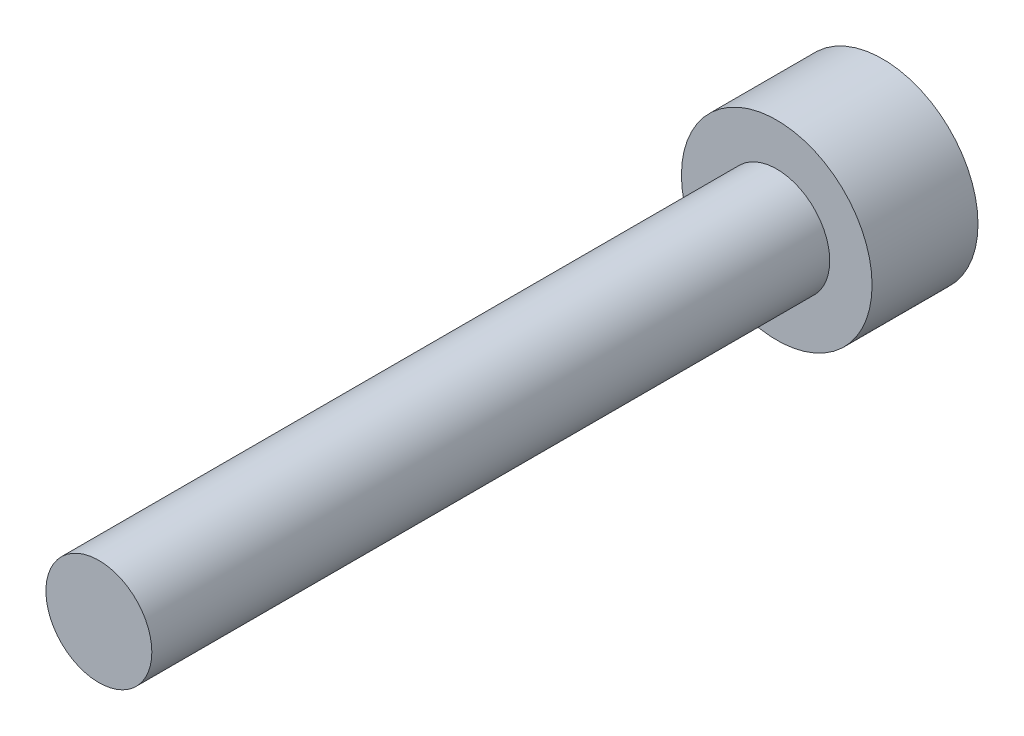
ISO-10303-21;
HEADER;
FILE_DESCRIPTION(('STEP AP214'),'2;1');
FILE_NAME('part.step','',(''),(''),'','','');
FILE_SCHEMA(('AUTOMOTIVE_DESIGN { 1 0 10303 214 1 1 1 1 }'));
ENDSEC;
DATA;
#1=APPLICATION_CONTEXT('core data for automotive mechanical design processes');
#2=APPLICATION_PROTOCOL_DEFINITION('international standard','automotive_design',2000,#1);
#3=PRODUCT_CONTEXT('',#1,'mechanical');
#4=PRODUCT('Part','Part','',(#3));
#5=PRODUCT_RELATED_PRODUCT_CATEGORY('part','',(#4));
#6=PRODUCT_DEFINITION_FORMATION('','',#4);
#7=PRODUCT_DEFINITION_CONTEXT('part definition',#1,'design');
#8=PRODUCT_DEFINITION('design','',#6,#7);
#9=PRODUCT_DEFINITION_SHAPE('','',#8);
#10=(LENGTH_UNIT() NAMED_UNIT(*) SI_UNIT(.MILLI.,.METRE.));
#11=(NAMED_UNIT(*) PLANE_ANGLE_UNIT() SI_UNIT($,.RADIAN.));
#12=(NAMED_UNIT(*) SI_UNIT($,.STERADIAN.) SOLID_ANGLE_UNIT());
#13=UNCERTAINTY_MEASURE_WITH_UNIT(LENGTH_MEASURE(1.E-05),#10,'distance_accuracy_value','');
#14=(GEOMETRIC_REPRESENTATION_CONTEXT(3) GLOBAL_UNCERTAINTY_ASSIGNED_CONTEXT((#13)) GLOBAL_UNIT_ASSIGNED_CONTEXT((#10,
#11,#12)) REPRESENTATION_CONTEXT('',''));
#15=CARTESIAN_POINT('',(0.,0.,0.));
#16=DIRECTION('',(0.,0.,1.));
#17=DIRECTION('',(1.,0.,0.));
#18=AXIS2_PLACEMENT_3D('',#15,#16,#17);
#19=CARTESIAN_POINT('',(0.,0.,-2.5));
#20=DIRECTION('',(0.,0.,1.));
#21=DIRECTION('',(1.,0.,0.));
#22=AXIS2_PLACEMENT_3D('',#19,#20,#21);
#23=PLANE('',#22);
#24=CARTESIAN_POINT('',(0.,0.,-2.5));
#25=DIRECTION('',(0.,0.,1.));
#26=DIRECTION('',(1.,0.,0.));
#27=AXIS2_PLACEMENT_3D('',#24,#25,#26);
#28=CIRCLE('',#27,2.25);
#29=CARTESIAN_POINT('',(2.25,0.,-2.5));
#30=VERTEX_POINT('',#29);
#31=EDGE_CURVE('E50',#30,#30,#28,.T.);
#32=ORIENTED_EDGE('',*,*,#31,.F.);
#33=EDGE_LOOP('',(#32));
#34=FACE_BOUND('',#33,.T.);
#35=DIRECTION('',(0.866025403784441,-0.499999999999995,0.));
#36=VECTOR('',#35,1.);
#37=CARTESIAN_POINT('',(-0.999999999999993,-0.577350269189637,-2.5));
#38=LINE('',#37,#36);
#39=CARTESIAN_POINT('',(-0.999999999999993,-0.577350269189637,-2.5));
#40=VERTEX_POINT('',#39);
#41=CARTESIAN_POINT('',(0.,-1.15470053837925,-2.5));
#42=VERTEX_POINT('',#41);
#43=EDGE_CURVE('E64',#40,#42,#38,.T.);
#44=ORIENTED_EDGE('',*,*,#43,.T.);
#45=DIRECTION('',(0.866025403784438,0.500000000000001,0.));
#46=VECTOR('',#45,1.);
#47=CARTESIAN_POINT('',(0.,-1.15470053837925,-2.5));
#48=LINE('',#47,#46);
#49=CARTESIAN_POINT('',(1.,-0.577350269189624,-2.5));
#50=VERTEX_POINT('',#49);
#51=EDGE_CURVE('E136',#42,#50,#48,.T.);
#52=ORIENTED_EDGE('',*,*,#51,.T.);
#53=DIRECTION('',(0.,1.,0.));
#54=VECTOR('',#53,1.);
#55=CARTESIAN_POINT('',(1.,-0.577350269189624,-2.5));
#56=LINE('',#55,#54);
#57=CARTESIAN_POINT('',(0.999999999999998,0.57735026918963,-2.5));
#58=VERTEX_POINT('',#57);
#59=EDGE_CURVE('E141',#50,#58,#56,.T.);
#60=ORIENTED_EDGE('',*,*,#59,.T.);
#61=DIRECTION('',(-0.866025403784442,0.499999999999995,0.));
#62=VECTOR('',#61,1.);
#63=CARTESIAN_POINT('',(0.999999999999998,0.57735026918963,-2.5));
#64=LINE('',#63,#62);
#65=CARTESIAN_POINT('',(0.,1.15470053837925,-2.5));
#66=VERTEX_POINT('',#65);
#67=EDGE_CURVE('E150',#58,#66,#64,.T.);
#68=ORIENTED_EDGE('',*,*,#67,.T.);
#69=DIRECTION('',(-0.866025403784434,-0.500000000000007,0.));
#70=VECTOR('',#69,1.);
#71=CARTESIAN_POINT('',(0.,1.15470053837925,-2.5));
#72=LINE('',#71,#70);
#73=CARTESIAN_POINT('',(-1.00000000000001,0.577350269189617,-2.5));
#74=VERTEX_POINT('',#73);
#75=EDGE_CURVE('E125',#66,#74,#72,.T.);
#76=ORIENTED_EDGE('',*,*,#75,.T.);
#77=DIRECTION('',(0.,-1.,0.));
#78=VECTOR('',#77,1.);
#79=CARTESIAN_POINT('',(-1.00000000000001,0.577350269189617,-2.5));
#80=LINE('',#79,#78);
#81=EDGE_CURVE('E155',#74,#40,#80,.T.);
#82=ORIENTED_EDGE('',*,*,#81,.T.);
#83=EDGE_LOOP('',(#44,#52,#60,#68,#76,#82));
#84=FACE_BOUND('',#83,.T.);
#85=ADVANCED_FACE('F43',(#34,#84),#23,.F.);
#86=CARTESIAN_POINT('',(0.,0.,0.));
#87=DIRECTION('',(0.,0.,-1.));
#88=DIRECTION('',(-1.,0.,0.));
#89=AXIS2_PLACEMENT_3D('',#86,#87,#88);
#90=CYLINDRICAL_SURFACE('',#89,2.25);
#91=CARTESIAN_POINT('',(0.,0.,0.));
#92=DIRECTION('',(0.,0.,1.));
#93=DIRECTION('',(1.,0.,0.));
#94=AXIS2_PLACEMENT_3D('',#91,#92,#93);
#95=CIRCLE('',#94,2.25);
#96=CARTESIAN_POINT('',(2.25,0.,0.));
#97=VERTEX_POINT('',#96);
#98=EDGE_CURVE('E52',#97,#97,#95,.T.);
#99=ORIENTED_EDGE('',*,*,#98,.F.);
#100=EDGE_LOOP('',(#99));
#101=FACE_BOUND('',#100,.T.);
#102=ORIENTED_EDGE('',*,*,#31,.T.);
#103=EDGE_LOOP('',(#102));
#104=FACE_BOUND('',#103,.T.);
#105=ADVANCED_FACE('F44',(#101,#104),#90,.T.);
#106=CARTESIAN_POINT('',(0.,0.,0.));
#107=DIRECTION('',(0.,0.,1.));
#108=DIRECTION('',(1.,0.,0.));
#109=AXIS2_PLACEMENT_3D('',#106,#107,#108);
#110=PLANE('',#109);
#111=CARTESIAN_POINT('',(0.,0.,0.));
#112=DIRECTION('',(0.,0.,1.));
#113=DIRECTION('',(1.,0.,0.));
#114=AXIS2_PLACEMENT_3D('',#111,#112,#113);
#115=CIRCLE('',#114,1.25);
#116=CARTESIAN_POINT('',(1.25,0.,0.));
#117=VERTEX_POINT('',#116);
#118=EDGE_CURVE('E11',#117,#117,#115,.T.);
#119=ORIENTED_EDGE('',*,*,#118,.F.);
#120=EDGE_LOOP('',(#119));
#121=FACE_BOUND('',#120,.T.);
#122=ORIENTED_EDGE('',*,*,#98,.T.);
#123=EDGE_LOOP('',(#122));
#124=FACE_BOUND('',#123,.T.);
#125=ADVANCED_FACE('F211',(#121,#124),#110,.T.);
#126=CARTESIAN_POINT('',(0.,0.,16.));
#127=DIRECTION('',(0.,0.,-1.));
#128=DIRECTION('',(-1.,0.,0.));
#129=AXIS2_PLACEMENT_3D('',#126,#127,#128);
#130=CYLINDRICAL_SURFACE('',#129,1.25);
#131=CARTESIAN_POINT('',(0.,0.,16.));
#132=DIRECTION('',(0.,0.,1.));
#133=DIRECTION('',(1.,0.,0.));
#134=AXIS2_PLACEMENT_3D('',#131,#132,#133);
#135=CIRCLE('',#134,1.25);
#136=CARTESIAN_POINT('',(1.25,0.,16.));
#137=VERTEX_POINT('',#136);
#138=EDGE_CURVE('E169',#137,#137,#135,.T.);
#139=ORIENTED_EDGE('',*,*,#138,.F.);
#140=EDGE_LOOP('',(#139));
#141=FACE_BOUND('',#140,.T.);
#142=ORIENTED_EDGE('',*,*,#118,.T.);
#143=EDGE_LOOP('',(#142));
#144=FACE_BOUND('',#143,.T.);
#145=ADVANCED_FACE('F210',(#141,#144),#130,.T.);
#146=CARTESIAN_POINT('',(0.,0.,16.));
#147=DIRECTION('',(0.,0.,1.));
#148=DIRECTION('',(1.,0.,0.));
#149=AXIS2_PLACEMENT_3D('',#146,#147,#148);
#150=PLANE('',#149);
#151=ORIENTED_EDGE('',*,*,#138,.T.);
#152=EDGE_LOOP('',(#151));
#153=FACE_BOUND('',#152,.T.);
#154=ADVANCED_FACE('F203',(#153),#150,.T.);
#155=CARTESIAN_POINT('',(-0.999999999999993,-0.577350269189637,-1.25));
#156=DIRECTION('',(0.499999999999995,0.866025403784441,0.));
#157=DIRECTION('',(-0.866025403784441,0.499999999999995,0.));
#158=AXIS2_PLACEMENT_3D('',#155,#156,#157);
#159=PLANE('',#158);
#160=ORIENTED_EDGE('',*,*,#43,.F.);
#161=DIRECTION('',(0.,0.,-1.));
#162=VECTOR('',#161,1.);
#163=CARTESIAN_POINT('',(-0.999999999999993,-0.577350269189637,-1.25));
#164=LINE('',#163,#162);
#165=CARTESIAN_POINT('',(-0.999999999999993,-0.577350269189637,-1.25));
#166=VERTEX_POINT('',#165);
#167=EDGE_CURVE('E135',#166,#40,#164,.T.);
#168=ORIENTED_EDGE('',*,*,#167,.F.);
#169=DIRECTION('',(0.866025403784441,-0.499999999999995,0.));
#170=VECTOR('',#169,1.);
#171=CARTESIAN_POINT('',(-0.999999999999993,-0.577350269189637,-1.25));
#172=LINE('',#171,#170);
#173=CARTESIAN_POINT('',(0.,-1.15470053837925,-1.25));
#174=VERTEX_POINT('',#173);
#175=EDGE_CURVE('E156',#166,#174,#172,.T.);
#176=ORIENTED_EDGE('',*,*,#175,.T.);
#177=DIRECTION('',(0.,0.,-1.));
#178=VECTOR('',#177,1.);
#179=CARTESIAN_POINT('',(0.,-1.15470053837925,-1.25));
#180=LINE('',#179,#178);
#181=EDGE_CURVE('E164',#174,#42,#180,.T.);
#182=ORIENTED_EDGE('',*,*,#181,.T.);
#183=EDGE_LOOP('',(#160,#168,#176,#182));
#184=FACE_BOUND('',#183,.T.);
#185=ADVANCED_FACE('F181',(#184),#159,.T.);
#186=CARTESIAN_POINT('',(0.,-1.15470053837925,-1.25));
#187=DIRECTION('',(-0.500000000000001,0.866025403784438,0.));
#188=DIRECTION('',(-0.866025403784438,-0.500000000000001,0.));
#189=AXIS2_PLACEMENT_3D('',#186,#187,#188);
#190=PLANE('',#189);
#191=ORIENTED_EDGE('',*,*,#51,.F.);
#192=ORIENTED_EDGE('',*,*,#181,.F.);
#193=DIRECTION('',(0.866025403784438,0.500000000000001,0.));
#194=VECTOR('',#193,1.);
#195=CARTESIAN_POINT('',(0.,-1.15470053837925,-1.25));
#196=LINE('',#195,#194);
#197=CARTESIAN_POINT('',(1.,-0.577350269189624,-1.25));
#198=VERTEX_POINT('',#197);
#199=EDGE_CURVE('E99',#174,#198,#196,.T.);
#200=ORIENTED_EDGE('',*,*,#199,.T.);
#201=DIRECTION('',(0.,0.,-1.));
#202=VECTOR('',#201,1.);
#203=CARTESIAN_POINT('',(1.,-0.577350269189624,-1.25));
#204=LINE('',#203,#202);
#205=EDGE_CURVE('E162',#198,#50,#204,.T.);
#206=ORIENTED_EDGE('',*,*,#205,.T.);
#207=EDGE_LOOP('',(#191,#192,#200,#206));
#208=FACE_BOUND('',#207,.T.);
#209=ADVANCED_FACE('F191',(#208),#190,.T.);
#210=CARTESIAN_POINT('',(1.,-0.577350269189624,-1.25));
#211=DIRECTION('',(-1.,0.,0.));
#212=DIRECTION('',(0.,-1.,0.));
#213=AXIS2_PLACEMENT_3D('',#210,#211,#212);
#214=PLANE('',#213);
#215=ORIENTED_EDGE('',*,*,#59,.F.);
#216=ORIENTED_EDGE('',*,*,#205,.F.);
#217=DIRECTION('',(0.,1.,0.));
#218=VECTOR('',#217,1.);
#219=CARTESIAN_POINT('',(1.,-0.577350269189624,-1.25));
#220=LINE('',#219,#218);
#221=CARTESIAN_POINT('',(0.999999999999998,0.57735026918963,-1.25));
#222=VERTEX_POINT('',#221);
#223=EDGE_CURVE('E118',#198,#222,#220,.T.);
#224=ORIENTED_EDGE('',*,*,#223,.T.);
#225=DIRECTION('',(0.,0.,-1.));
#226=VECTOR('',#225,1.);
#227=CARTESIAN_POINT('',(0.999999999999998,0.57735026918963,-1.25));
#228=LINE('',#227,#226);
#229=EDGE_CURVE('E113',#222,#58,#228,.T.);
#230=ORIENTED_EDGE('',*,*,#229,.T.);
#231=EDGE_LOOP('',(#215,#216,#224,#230));
#232=FACE_BOUND('',#231,.T.);
#233=ADVANCED_FACE('F194',(#232),#214,.T.);
#234=CARTESIAN_POINT('',(0.999999999999998,0.57735026918963,-1.25));
#235=DIRECTION('',(-0.499999999999995,-0.866025403784442,0.));
#236=DIRECTION('',(0.866025403784442,-0.499999999999995,0.));
#237=AXIS2_PLACEMENT_3D('',#234,#235,#236);
#238=PLANE('',#237);
#239=ORIENTED_EDGE('',*,*,#67,.F.);
#240=ORIENTED_EDGE('',*,*,#229,.F.);
#241=DIRECTION('',(-0.866025403784442,0.499999999999995,0.));
#242=VECTOR('',#241,1.);
#243=CARTESIAN_POINT('',(0.999999999999998,0.57735026918963,-1.25));
#244=LINE('',#243,#242);
#245=CARTESIAN_POINT('',(0.,1.15470053837925,-1.25));
#246=VERTEX_POINT('',#245);
#247=EDGE_CURVE('E109',#222,#246,#244,.T.);
#248=ORIENTED_EDGE('',*,*,#247,.T.);
#249=DIRECTION('',(0.,0.,-1.));
#250=VECTOR('',#249,1.);
#251=CARTESIAN_POINT('',(0.,1.15470053837925,-1.25));
#252=LINE('',#251,#250);
#253=EDGE_CURVE('E111',#246,#66,#252,.T.);
#254=ORIENTED_EDGE('',*,*,#253,.T.);
#255=EDGE_LOOP('',(#239,#240,#248,#254));
#256=FACE_BOUND('',#255,.T.);
#257=ADVANCED_FACE('F114',(#256),#238,.T.);
#258=CARTESIAN_POINT('',(0.,1.15470053837925,-1.25));
#259=DIRECTION('',(0.500000000000007,-0.866025403784435,0.));
#260=DIRECTION('',(0.866025403784435,0.500000000000007,0.));
#261=AXIS2_PLACEMENT_3D('',#258,#259,#260);
#262=PLANE('',#261);
#263=ORIENTED_EDGE('',*,*,#75,.F.);
#264=ORIENTED_EDGE('',*,*,#253,.F.);
#265=DIRECTION('',(-0.866025403784434,-0.500000000000007,0.));
#266=VECTOR('',#265,1.);
#267=CARTESIAN_POINT('',(0.,1.15470053837925,-1.25));
#268=LINE('',#267,#266);
#269=CARTESIAN_POINT('',(-1.00000000000001,0.577350269189617,-1.25));
#270=VERTEX_POINT('',#269);
#271=EDGE_CURVE('E120',#246,#270,#268,.T.);
#272=ORIENTED_EDGE('',*,*,#271,.T.);
#273=DIRECTION('',(0.,0.,-1.));
#274=VECTOR('',#273,1.);
#275=CARTESIAN_POINT('',(-1.00000000000001,0.577350269189617,-1.25));
#276=LINE('',#275,#274);
#277=EDGE_CURVE('E93',#270,#74,#276,.T.);
#278=ORIENTED_EDGE('',*,*,#277,.T.);
#279=EDGE_LOOP('',(#263,#264,#272,#278));
#280=FACE_BOUND('',#279,.T.);
#281=ADVANCED_FACE('F122',(#280),#262,.T.);
#282=CARTESIAN_POINT('',(-1.00000000000001,0.577350269189617,-1.25));
#283=DIRECTION('',(1.,0.,0.));
#284=DIRECTION('',(0.,1.,0.));
#285=AXIS2_PLACEMENT_3D('',#282,#283,#284);
#286=PLANE('',#285);
#287=ORIENTED_EDGE('',*,*,#81,.F.);
#288=ORIENTED_EDGE('',*,*,#277,.F.);
#289=DIRECTION('',(0.,-1.,0.));
#290=VECTOR('',#289,1.);
#291=CARTESIAN_POINT('',(-1.00000000000001,0.577350269189617,-1.25));
#292=LINE('',#291,#290);
#293=EDGE_CURVE('E66',#270,#166,#292,.T.);
#294=ORIENTED_EDGE('',*,*,#293,.T.);
#295=ORIENTED_EDGE('',*,*,#167,.T.);
#296=EDGE_LOOP('',(#287,#288,#294,#295));
#297=FACE_BOUND('',#296,.T.);
#298=ADVANCED_FACE('F185',(#297),#286,.T.);
#299=CARTESIAN_POINT('',(0.,0.,-1.25));
#300=DIRECTION('',(0.,0.,1.));
#301=DIRECTION('',(1.,0.,0.));
#302=AXIS2_PLACEMENT_3D('',#299,#300,#301);
#303=PLANE('',#302);
#304=ORIENTED_EDGE('',*,*,#175,.F.);
#305=ORIENTED_EDGE('',*,*,#293,.F.);
#306=ORIENTED_EDGE('',*,*,#271,.F.);
#307=ORIENTED_EDGE('',*,*,#247,.F.);
#308=ORIENTED_EDGE('',*,*,#223,.F.);
#309=ORIENTED_EDGE('',*,*,#199,.F.);
#310=EDGE_LOOP('',(#304,#305,#306,#307,#308,#309));
#311=FACE_BOUND('',#310,.T.);
#312=ADVANCED_FACE('F130',(#311),#303,.F.);
#313=CLOSED_SHELL('',(#85,#105,#125,#145,#154,#185,#209,#233,#257,#281,#298,#312));
#314=MANIFOLD_SOLID_BREP('B2',#313);
#315=ADVANCED_BREP_SHAPE_REPRESENTATION('',(#18,#314),#14);
#316=SHAPE_DEFINITION_REPRESENTATION(#9,#315);
ENDSEC;
END-ISO-10303-21;
